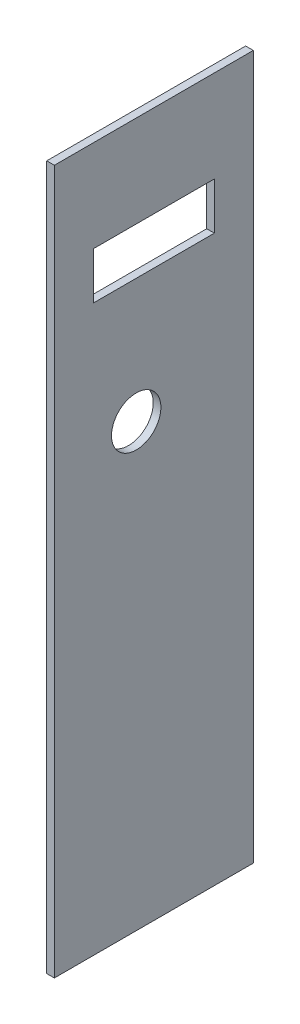
ISO-10303-21;
HEADER;
FILE_DESCRIPTION(('STEP AP214'),'2;1');
FILE_NAME('part.step','',(''),(''),'','','');
FILE_SCHEMA(('AUTOMOTIVE_DESIGN { 1 0 10303 214 1 1 1 1 }'));
ENDSEC;
DATA;
#1=APPLICATION_CONTEXT('core data for automotive mechanical design processes');
#2=APPLICATION_PROTOCOL_DEFINITION('international standard','automotive_design',2000,#1);
#3=PRODUCT_CONTEXT('',#1,'mechanical');
#4=PRODUCT('Part','Part','',(#3));
#5=PRODUCT_RELATED_PRODUCT_CATEGORY('part','',(#4));
#6=PRODUCT_DEFINITION_FORMATION('','',#4);
#7=PRODUCT_DEFINITION_CONTEXT('part definition',#1,'design');
#8=PRODUCT_DEFINITION('design','',#6,#7);
#9=PRODUCT_DEFINITION_SHAPE('','',#8);
#10=(LENGTH_UNIT() NAMED_UNIT(*) SI_UNIT(.MILLI.,.METRE.));
#11=(NAMED_UNIT(*) PLANE_ANGLE_UNIT() SI_UNIT($,.RADIAN.));
#12=(NAMED_UNIT(*) SI_UNIT($,.STERADIAN.) SOLID_ANGLE_UNIT());
#13=UNCERTAINTY_MEASURE_WITH_UNIT(LENGTH_MEASURE(1.E-05),#10,'distance_accuracy_value','');
#14=(GEOMETRIC_REPRESENTATION_CONTEXT(3) GLOBAL_UNCERTAINTY_ASSIGNED_CONTEXT((#13)) GLOBAL_UNIT_ASSIGNED_CONTEXT((#10,
#11,#12)) REPRESENTATION_CONTEXT('',''));
#15=CARTESIAN_POINT('',(0.,0.,0.));
#16=DIRECTION('',(0.,0.,1.));
#17=DIRECTION('',(1.,0.,0.));
#18=AXIS2_PLACEMENT_3D('',#15,#16,#17);
#19=CARTESIAN_POINT('',(3.175,0.,0.));
#20=DIRECTION('',(0.,0.,1.));
#21=DIRECTION('',(0.,-1.,0.));
#22=AXIS2_PLACEMENT_3D('',#19,#20,#21);
#23=PLANE('',#22);
#24=DIRECTION('',(0.,1.,0.));
#25=VECTOR('',#24,1.);
#26=CARTESIAN_POINT('',(0.,0.,0.));
#27=LINE('',#26,#25);
#28=CARTESIAN_POINT('',(0.,0.,0.));
#29=VERTEX_POINT('',#28);
#30=CARTESIAN_POINT('',(0.,292.1,0.));
#31=VERTEX_POINT('',#30);
#32=EDGE_CURVE('E112',#29,#31,#27,.T.);
#33=ORIENTED_EDGE('',*,*,#32,.F.);
#34=DIRECTION('',(-1.,0.,0.));
#35=VECTOR('',#34,1.);
#36=CARTESIAN_POINT('',(3.175,0.,0.));
#37=LINE('',#36,#35);
#38=CARTESIAN_POINT('',(3.175,0.,0.));
#39=VERTEX_POINT('',#38);
#40=EDGE_CURVE('E11',#39,#29,#37,.T.);
#41=ORIENTED_EDGE('',*,*,#40,.F.);
#42=DIRECTION('',(0.,1.,0.));
#43=VECTOR('',#42,1.);
#44=CARTESIAN_POINT('',(3.175,0.,0.));
#45=LINE('',#44,#43);
#46=CARTESIAN_POINT('',(3.175,292.1,0.));
#47=VERTEX_POINT('',#46);
#48=EDGE_CURVE('E135',#39,#47,#45,.T.);
#49=ORIENTED_EDGE('',*,*,#48,.T.);
#50=DIRECTION('',(-1.,0.,0.));
#51=VECTOR('',#50,1.);
#52=CARTESIAN_POINT('',(3.175,292.1,0.));
#53=LINE('',#52,#51);
#54=EDGE_CURVE('E36',#47,#31,#53,.T.);
#55=ORIENTED_EDGE('',*,*,#54,.T.);
#56=EDGE_LOOP('',(#33,#41,#49,#55));
#57=FACE_BOUND('',#56,.T.);
#58=ADVANCED_FACE('F33',(#57),#23,.T.);
#59=CARTESIAN_POINT('',(3.175,0.,0.));
#60=DIRECTION('',(0.,1.,0.));
#61=DIRECTION('',(0.,0.,1.));
#62=AXIS2_PLACEMENT_3D('',#59,#60,#61);
#63=PLANE('',#62);
#64=DIRECTION('',(0.,0.,-1.));
#65=VECTOR('',#64,1.);
#66=CARTESIAN_POINT('',(0.,0.,0.));
#67=LINE('',#66,#65);
#68=CARTESIAN_POINT('',(0.,0.,-82.55));
#69=VERTEX_POINT('',#68);
#70=EDGE_CURVE('E139',#29,#69,#67,.T.);
#71=ORIENTED_EDGE('',*,*,#70,.T.);
#72=DIRECTION('',(-1.,0.,0.));
#73=VECTOR('',#72,1.);
#74=CARTESIAN_POINT('',(3.175,0.,-82.55));
#75=LINE('',#74,#73);
#76=CARTESIAN_POINT('',(3.175,0.,-82.55));
#77=VERTEX_POINT('',#76);
#78=EDGE_CURVE('E41',#77,#69,#75,.T.);
#79=ORIENTED_EDGE('',*,*,#78,.F.);
#80=DIRECTION('',(0.,0.,-1.));
#81=VECTOR('',#80,1.);
#82=CARTESIAN_POINT('',(3.175,0.,0.));
#83=LINE('',#82,#81);
#84=EDGE_CURVE('E144',#39,#77,#83,.T.);
#85=ORIENTED_EDGE('',*,*,#84,.F.);
#86=ORIENTED_EDGE('',*,*,#40,.T.);
#87=EDGE_LOOP('',(#71,#79,#85,#86));
#88=FACE_BOUND('',#87,.T.);
#89=ADVANCED_FACE('F171',(#88),#63,.F.);
#90=CARTESIAN_POINT('',(3.175,0.,-82.55));
#91=DIRECTION('',(0.,0.,1.));
#92=DIRECTION('',(0.,-1.,0.));
#93=AXIS2_PLACEMENT_3D('',#90,#91,#92);
#94=PLANE('',#93);
#95=DIRECTION('',(0.,1.,0.));
#96=VECTOR('',#95,1.);
#97=CARTESIAN_POINT('',(0.,0.,-82.55));
#98=LINE('',#97,#96);
#99=CARTESIAN_POINT('',(0.,292.1,-82.55));
#100=VERTEX_POINT('',#99);
#101=EDGE_CURVE('E151',#69,#100,#98,.T.);
#102=ORIENTED_EDGE('',*,*,#101,.T.);
#103=DIRECTION('',(-1.,0.,0.));
#104=VECTOR('',#103,1.);
#105=CARTESIAN_POINT('',(3.175,292.1,-82.55));
#106=LINE('',#105,#104);
#107=CARTESIAN_POINT('',(3.175,292.1,-82.55));
#108=VERTEX_POINT('',#107);
#109=EDGE_CURVE('E156',#108,#100,#106,.T.);
#110=ORIENTED_EDGE('',*,*,#109,.F.);
#111=DIRECTION('',(0.,1.,0.));
#112=VECTOR('',#111,1.);
#113=CARTESIAN_POINT('',(3.175,0.,-82.55));
#114=LINE('',#113,#112);
#115=EDGE_CURVE('E142',#77,#108,#114,.T.);
#116=ORIENTED_EDGE('',*,*,#115,.F.);
#117=ORIENTED_EDGE('',*,*,#78,.T.);
#118=EDGE_LOOP('',(#102,#110,#116,#117));
#119=FACE_BOUND('',#118,.T.);
#120=ADVANCED_FACE('F175',(#119),#94,.F.);
#121=CARTESIAN_POINT('',(3.175,292.1,0.));
#122=DIRECTION('',(0.,1.,0.));
#123=DIRECTION('',(0.,0.,1.));
#124=AXIS2_PLACEMENT_3D('',#121,#122,#123);
#125=PLANE('',#124);
#126=DIRECTION('',(0.,0.,-1.));
#127=VECTOR('',#126,1.);
#128=CARTESIAN_POINT('',(0.,292.1,0.));
#129=LINE('',#128,#127);
#130=EDGE_CURVE('E148',#31,#100,#129,.T.);
#131=ORIENTED_EDGE('',*,*,#130,.F.);
#132=ORIENTED_EDGE('',*,*,#54,.F.);
#133=DIRECTION('',(0.,0.,-1.));
#134=VECTOR('',#133,1.);
#135=CARTESIAN_POINT('',(3.175,292.1,0.));
#136=LINE('',#135,#134);
#137=EDGE_CURVE('E138',#47,#108,#136,.T.);
#138=ORIENTED_EDGE('',*,*,#137,.T.);
#139=ORIENTED_EDGE('',*,*,#109,.T.);
#140=EDGE_LOOP('',(#131,#132,#138,#139));
#141=FACE_BOUND('',#140,.T.);
#142=ADVANCED_FACE('F164',(#141),#125,.T.);
#143=CARTESIAN_POINT('',(3.175,0.,0.));
#144=DIRECTION('',(-1.,0.,0.));
#145=DIRECTION('',(0.,0.,1.));
#146=AXIS2_PLACEMENT_3D('',#143,#144,#145);
#147=PLANE('',#146);
#148=CARTESIAN_POINT('',(3.175,183.037474175552,-33.9635225466932));
#149=DIRECTION('',(-1.,0.,0.));
#150=DIRECTION('',(0.,0.,1.));
#151=AXIS2_PLACEMENT_3D('',#148,#149,#150);
#152=CIRCLE('',#151,10.25);
#153=CARTESIAN_POINT('',(3.175,183.037474175552,-23.7135225466932));
#154=VERTEX_POINT('',#153);
#155=EDGE_CURVE('E263',#154,#154,#152,.F.);
#156=ORIENTED_EDGE('',*,*,#155,.F.);
#157=EDGE_LOOP('',(#156));
#158=FACE_BOUND('',#157,.T.);
#159=DIRECTION('',(0.,0.,1.));
#160=VECTOR('',#159,1.);
#161=CARTESIAN_POINT('',(3.175,254.,-66.4));
#162=LINE('',#161,#160);
#163=CARTESIAN_POINT('',(3.175,254.,-66.4));
#164=VERTEX_POINT('',#163);
#165=CARTESIAN_POINT('',(3.175,254.,-16.15));
#166=VERTEX_POINT('',#165);
#167=EDGE_CURVE('E118',#164,#166,#162,.T.);
#168=ORIENTED_EDGE('',*,*,#167,.F.);
#169=DIRECTION('',(0.,1.,0.));
#170=VECTOR('',#169,1.);
#171=CARTESIAN_POINT('',(3.175,234.5,-66.4));
#172=LINE('',#171,#170);
#173=CARTESIAN_POINT('',(3.175,234.5,-66.4));
#174=VERTEX_POINT('',#173);
#175=EDGE_CURVE('E100',#174,#164,#172,.T.);
#176=ORIENTED_EDGE('',*,*,#175,.F.);
#177=DIRECTION('',(0.,0.,-1.));
#178=VECTOR('',#177,1.);
#179=CARTESIAN_POINT('',(3.175,234.5,-66.4));
#180=LINE('',#179,#178);
#181=CARTESIAN_POINT('',(3.175,234.5,-16.15));
#182=VERTEX_POINT('',#181);
#183=EDGE_CURVE('E109',#182,#174,#180,.T.);
#184=ORIENTED_EDGE('',*,*,#183,.F.);
#185=DIRECTION('',(0.,-1.,0.));
#186=VECTOR('',#185,1.);
#187=CARTESIAN_POINT('',(3.175,234.5,-16.15));
#188=LINE('',#187,#186);
#189=EDGE_CURVE('E49',#166,#182,#188,.T.);
#190=ORIENTED_EDGE('',*,*,#189,.F.);
#191=EDGE_LOOP('',(#168,#176,#184,#190));
#192=FACE_BOUND('',#191,.T.);
#193=ORIENTED_EDGE('',*,*,#48,.F.);
#194=ORIENTED_EDGE('',*,*,#84,.T.);
#195=ORIENTED_EDGE('',*,*,#115,.T.);
#196=ORIENTED_EDGE('',*,*,#137,.F.);
#197=EDGE_LOOP('',(#193,#194,#195,#196));
#198=FACE_BOUND('',#197,.T.);
#199=ADVANCED_FACE('F115',(#158,#192,#198),#147,.F.);
#200=CARTESIAN_POINT('',(0.,0.,0.));
#201=DIRECTION('',(-1.,0.,0.));
#202=DIRECTION('',(0.,0.,1.));
#203=AXIS2_PLACEMENT_3D('',#200,#201,#202);
#204=PLANE('',#203);
#205=CARTESIAN_POINT('',(0.,183.037474175552,-33.9635225466932));
#206=DIRECTION('',(-1.,0.,0.));
#207=DIRECTION('',(0.,0.,1.));
#208=AXIS2_PLACEMENT_3D('',#205,#206,#207);
#209=CIRCLE('',#208,10.25);
#210=CARTESIAN_POINT('',(0.,183.037474175552,-23.7135225466932));
#211=VERTEX_POINT('',#210);
#212=EDGE_CURVE('E261',#211,#211,#209,.T.);
#213=ORIENTED_EDGE('',*,*,#212,.F.);
#214=EDGE_LOOP('',(#213));
#215=FACE_BOUND('',#214,.T.);
#216=DIRECTION('',(0.,-1.,0.));
#217=VECTOR('',#216,1.);
#218=CARTESIAN_POINT('',(0.,234.5,-66.4));
#219=LINE('',#218,#217);
#220=CARTESIAN_POINT('',(0.,254.,-66.4));
#221=VERTEX_POINT('',#220);
#222=CARTESIAN_POINT('',(0.,234.5,-66.4));
#223=VERTEX_POINT('',#222);
#224=EDGE_CURVE('E57',#221,#223,#219,.T.);
#225=ORIENTED_EDGE('',*,*,#224,.F.);
#226=DIRECTION('',(0.,0.,-1.));
#227=VECTOR('',#226,1.);
#228=CARTESIAN_POINT('',(0.,254.,-66.4));
#229=LINE('',#228,#227);
#230=CARTESIAN_POINT('',(0.,254.,-16.15));
#231=VERTEX_POINT('',#230);
#232=EDGE_CURVE('E106',#231,#221,#229,.T.);
#233=ORIENTED_EDGE('',*,*,#232,.F.);
#234=DIRECTION('',(0.,1.,0.));
#235=VECTOR('',#234,1.);
#236=CARTESIAN_POINT('',(0.,234.5,-16.15));
#237=LINE('',#236,#235);
#238=CARTESIAN_POINT('',(0.,234.5,-16.15));
#239=VERTEX_POINT('',#238);
#240=EDGE_CURVE('E126',#239,#231,#237,.T.);
#241=ORIENTED_EDGE('',*,*,#240,.F.);
#242=DIRECTION('',(0.,0.,1.));
#243=VECTOR('',#242,1.);
#244=CARTESIAN_POINT('',(0.,234.5,-66.4));
#245=LINE('',#244,#243);
#246=EDGE_CURVE('E120',#223,#239,#245,.T.);
#247=ORIENTED_EDGE('',*,*,#246,.F.);
#248=EDGE_LOOP('',(#225,#233,#241,#247));
#249=FACE_BOUND('',#248,.T.);
#250=ORIENTED_EDGE('',*,*,#32,.T.);
#251=ORIENTED_EDGE('',*,*,#130,.T.);
#252=ORIENTED_EDGE('',*,*,#101,.F.);
#253=ORIENTED_EDGE('',*,*,#70,.F.);
#254=EDGE_LOOP('',(#250,#251,#252,#253));
#255=FACE_BOUND('',#254,.T.);
#256=ADVANCED_FACE('F168',(#215,#249,#255),#204,.T.);
#257=CARTESIAN_POINT('',(3.176,234.5,-66.4));
#258=DIRECTION('',(0.,0.,-1.));
#259=DIRECTION('',(-1.,0.,0.));
#260=AXIS2_PLACEMENT_3D('',#257,#258,#259);
#261=PLANE('',#260);
#262=ORIENTED_EDGE('',*,*,#175,.T.);
#263=DIRECTION('',(-1.,0.,0.));
#264=VECTOR('',#263,1.);
#265=CARTESIAN_POINT('',(3.176,254.,-66.4));
#266=LINE('',#265,#264);
#267=EDGE_CURVE('E113',#164,#221,#266,.T.);
#268=ORIENTED_EDGE('',*,*,#267,.T.);
#269=ORIENTED_EDGE('',*,*,#224,.T.);
#270=DIRECTION('',(-1.,0.,0.));
#271=VECTOR('',#270,1.);
#272=CARTESIAN_POINT('',(3.176,234.5,-66.4));
#273=LINE('',#272,#271);
#274=EDGE_CURVE('E96',#174,#223,#273,.T.);
#275=ORIENTED_EDGE('',*,*,#274,.F.);
#276=EDGE_LOOP('',(#262,#268,#269,#275));
#277=FACE_BOUND('',#276,.T.);
#278=ADVANCED_FACE('F98',(#277),#261,.F.);
#279=CARTESIAN_POINT('',(3.176,254.,-66.4));
#280=DIRECTION('',(0.,1.,0.));
#281=DIRECTION('',(0.,0.,1.));
#282=AXIS2_PLACEMENT_3D('',#279,#280,#281);
#283=PLANE('',#282);
#284=ORIENTED_EDGE('',*,*,#167,.T.);
#285=DIRECTION('',(-1.,0.,0.));
#286=VECTOR('',#285,1.);
#287=CARTESIAN_POINT('',(3.176,254.,-16.15));
#288=LINE('',#287,#286);
#289=EDGE_CURVE('E132',#166,#231,#288,.T.);
#290=ORIENTED_EDGE('',*,*,#289,.T.);
#291=ORIENTED_EDGE('',*,*,#232,.T.);
#292=ORIENTED_EDGE('',*,*,#267,.F.);
#293=EDGE_LOOP('',(#284,#290,#291,#292));
#294=FACE_BOUND('',#293,.T.);
#295=ADVANCED_FACE('F221',(#294),#283,.F.);
#296=CARTESIAN_POINT('',(3.176,234.5,-16.15));
#297=DIRECTION('',(0.,0.,1.));
#298=DIRECTION('',(1.,0.,0.));
#299=AXIS2_PLACEMENT_3D('',#296,#297,#298);
#300=PLANE('',#299);
#301=ORIENTED_EDGE('',*,*,#189,.T.);
#302=DIRECTION('',(-1.,0.,0.));
#303=VECTOR('',#302,1.);
#304=CARTESIAN_POINT('',(3.176,234.5,-16.15));
#305=LINE('',#304,#303);
#306=EDGE_CURVE('E105',#182,#239,#305,.T.);
#307=ORIENTED_EDGE('',*,*,#306,.T.);
#308=ORIENTED_EDGE('',*,*,#240,.T.);
#309=ORIENTED_EDGE('',*,*,#289,.F.);
#310=EDGE_LOOP('',(#301,#307,#308,#309));
#311=FACE_BOUND('',#310,.T.);
#312=ADVANCED_FACE('F226',(#311),#300,.F.);
#313=CARTESIAN_POINT('',(3.176,234.5,-66.4));
#314=DIRECTION('',(0.,-1.,0.));
#315=DIRECTION('',(0.,0.,-1.));
#316=AXIS2_PLACEMENT_3D('',#313,#314,#315);
#317=PLANE('',#316);
#318=ORIENTED_EDGE('',*,*,#183,.T.);
#319=ORIENTED_EDGE('',*,*,#274,.T.);
#320=ORIENTED_EDGE('',*,*,#246,.T.);
#321=ORIENTED_EDGE('',*,*,#306,.F.);
#322=EDGE_LOOP('',(#318,#319,#320,#321));
#323=FACE_BOUND('',#322,.T.);
#324=ADVANCED_FACE('F110',(#323),#317,.F.);
#325=CARTESIAN_POINT('',(3.176,183.037474175552,-33.9635225466932));
#326=DIRECTION('',(-1.,0.,0.));
#327=DIRECTION('',(0.,0.,1.));
#328=AXIS2_PLACEMENT_3D('',#325,#326,#327);
#329=CYLINDRICAL_SURFACE('',#328,10.25);
#330=ORIENTED_EDGE('',*,*,#212,.T.);
#331=EDGE_LOOP('',(#330));
#332=FACE_BOUND('',#331,.T.);
#333=ORIENTED_EDGE('',*,*,#155,.T.);
#334=EDGE_LOOP('',(#333));
#335=FACE_BOUND('',#334,.T.);
#336=ADVANCED_FACE('F239',(#332,#335),#329,.F.);
#337=CLOSED_SHELL('',(#58,#89,#120,#142,#199,#256,#278,#295,#312,#324,#336));
#338=MANIFOLD_SOLID_BREP('B2',#337);
#339=ADVANCED_BREP_SHAPE_REPRESENTATION('',(#18,#338),#14);
#340=SHAPE_DEFINITION_REPRESENTATION(#9,#339);
ENDSEC;
END-ISO-10303-21;
